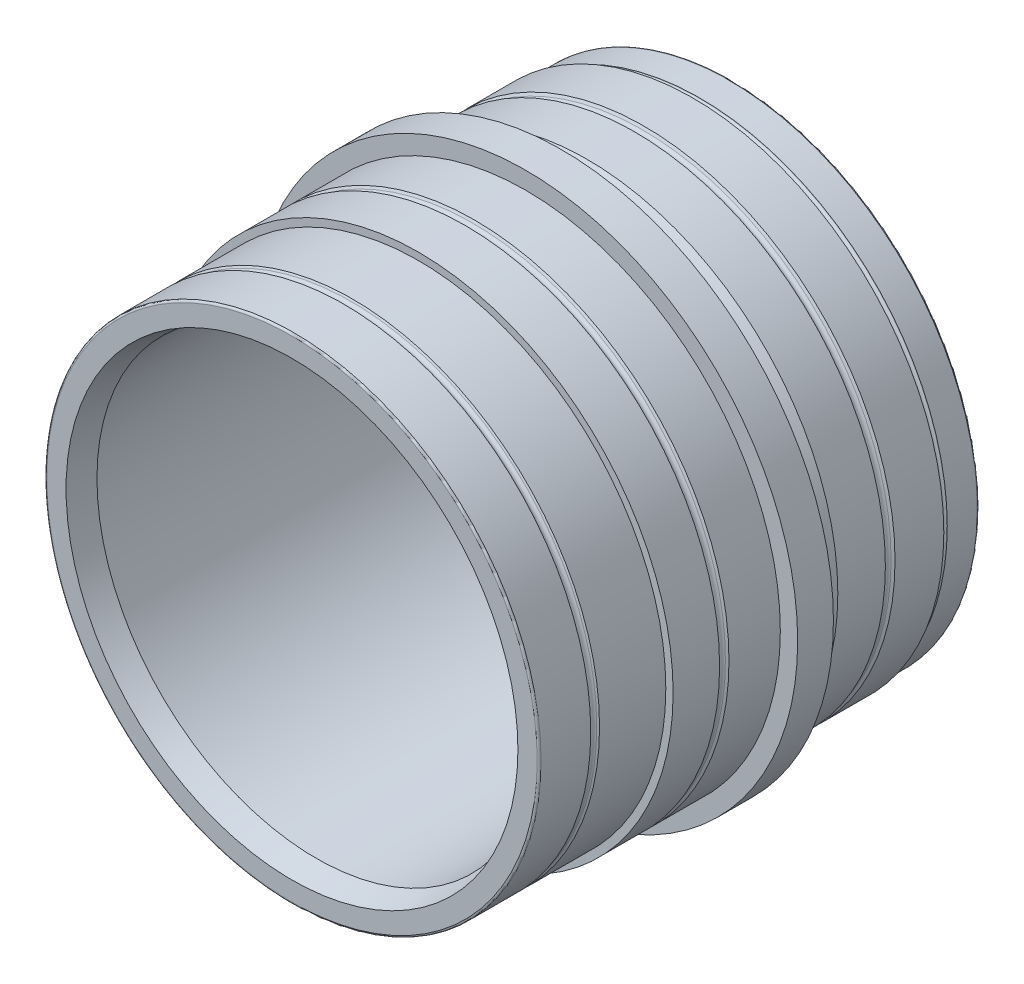
ISO-10303-21;
HEADER;
FILE_DESCRIPTION(('STEP AP214'),'2;1');
FILE_NAME('part.step','',(''),(''),'','','');
FILE_SCHEMA(('AUTOMOTIVE_DESIGN { 1 0 10303 214 1 1 1 1 }'));
ENDSEC;
DATA;
#1=APPLICATION_CONTEXT('core data for automotive mechanical design processes');
#2=APPLICATION_PROTOCOL_DEFINITION('international standard','automotive_design',2000,#1);
#3=PRODUCT_CONTEXT('',#1,'mechanical');
#4=PRODUCT('Part','Part','',(#3));
#5=PRODUCT_RELATED_PRODUCT_CATEGORY('part','',(#4));
#6=PRODUCT_DEFINITION_FORMATION('','',#4);
#7=PRODUCT_DEFINITION_CONTEXT('part definition',#1,'design');
#8=PRODUCT_DEFINITION('design','',#6,#7);
#9=PRODUCT_DEFINITION_SHAPE('','',#8);
#10=(LENGTH_UNIT() NAMED_UNIT(*) SI_UNIT(.MILLI.,.METRE.));
#11=(NAMED_UNIT(*) PLANE_ANGLE_UNIT() SI_UNIT($,.RADIAN.));
#12=(NAMED_UNIT(*) SI_UNIT($,.STERADIAN.) SOLID_ANGLE_UNIT());
#13=UNCERTAINTY_MEASURE_WITH_UNIT(LENGTH_MEASURE(1.E-05),#10,'distance_accuracy_value','');
#14=(GEOMETRIC_REPRESENTATION_CONTEXT(3) GLOBAL_UNCERTAINTY_ASSIGNED_CONTEXT((#13)) GLOBAL_UNIT_ASSIGNED_CONTEXT((#10,
#11,#12)) REPRESENTATION_CONTEXT('',''));
#15=CARTESIAN_POINT('',(0.,0.,0.));
#16=DIRECTION('',(0.,0.,1.));
#17=DIRECTION('',(1.,0.,0.));
#18=AXIS2_PLACEMENT_3D('',#15,#16,#17);
#19=CARTESIAN_POINT('',(0.,25.1575,0.));
#20=DIRECTION('',(0.,0.,-1.));
#21=DIRECTION('',(-1.,0.,0.));
#22=AXIS2_PLACEMENT_3D('',#19,#20,#21);
#23=PLANE('',#22);
#24=CARTESIAN_POINT('',(0.,0.,0.));
#25=DIRECTION('',(0.,0.,1.));
#26=DIRECTION('',(1.,0.,0.));
#27=AXIS2_PLACEMENT_3D('',#24,#25,#26);
#28=CIRCLE('',#27,23.1823729810778);
#29=CARTESIAN_POINT('',(23.1823729810778,0.,0.));
#30=VERTEX_POINT('',#29);
#31=EDGE_CURVE('E10',#30,#30,#28,.T.);
#32=ORIENTED_EDGE('',*,*,#31,.F.);
#33=EDGE_LOOP('',(#32));
#34=FACE_BOUND('',#33,.T.);
#35=CARTESIAN_POINT('',(0.,0.,0.));
#36=DIRECTION('',(0.,0.,1.));
#37=DIRECTION('',(1.,0.,0.));
#38=AXIS2_PLACEMENT_3D('',#35,#36,#37);
#39=CIRCLE('',#38,25.1575);
#40=CARTESIAN_POINT('',(25.1575,0.,0.));
#41=VERTEX_POINT('',#40);
#42=EDGE_CURVE('E148',#41,#41,#39,.T.);
#43=ORIENTED_EDGE('',*,*,#42,.T.);
#44=EDGE_LOOP('',(#43));
#45=FACE_BOUND('',#44,.T.);
#46=ADVANCED_FACE('F39',(#34,#45),#23,.F.);
#47=CARTESIAN_POINT('',(0.,0.,0.));
#48=DIRECTION('',(0.,0.,1.));
#49=DIRECTION('',(1.,0.,0.));
#50=AXIS2_PLACEMENT_3D('',#47,#48,#49);
#51=CONICAL_SURFACE('',#50,23.1823729810778,0.26179938779915);
#52=CARTESIAN_POINT('',(0.,0.,-2.5));
#53=DIRECTION('',(0.,0.,1.));
#54=DIRECTION('',(1.,0.,0.));
#55=AXIS2_PLACEMENT_3D('',#52,#53,#54);
#56=CIRCLE('',#55,22.5125);
#57=CARTESIAN_POINT('',(22.5125,0.,-2.5));
#58=VERTEX_POINT('',#57);
#59=EDGE_CURVE('E45',#58,#58,#56,.T.);
#60=ORIENTED_EDGE('',*,*,#59,.F.);
#61=EDGE_LOOP('',(#60));
#62=FACE_BOUND('',#61,.T.);
#63=ORIENTED_EDGE('',*,*,#31,.T.);
#64=EDGE_LOOP('',(#63));
#65=FACE_BOUND('',#64,.T.);
#66=ADVANCED_FACE('F347',(#62,#65),#51,.F.);
#67=CARTESIAN_POINT('',(0.,0.,0.));
#68=DIRECTION('',(0.,0.,1.));
#69=DIRECTION('',(1.,0.,0.));
#70=AXIS2_PLACEMENT_3D('',#67,#68,#69);
#71=CYLINDRICAL_SURFACE('',#70,22.5125);
#72=CARTESIAN_POINT('',(0.,0.,-42.65));
#73=DIRECTION('',(0.,0.,1.));
#74=DIRECTION('',(1.,0.,0.));
#75=AXIS2_PLACEMENT_3D('',#72,#73,#74);
#76=CIRCLE('',#75,22.5125);
#77=CARTESIAN_POINT('',(22.5125,0.,-42.65));
#78=VERTEX_POINT('',#77);
#79=EDGE_CURVE('E49',#78,#78,#76,.T.);
#80=ORIENTED_EDGE('',*,*,#79,.F.);
#81=EDGE_LOOP('',(#80));
#82=FACE_BOUND('',#81,.T.);
#83=ORIENTED_EDGE('',*,*,#59,.T.);
#84=EDGE_LOOP('',(#83));
#85=FACE_BOUND('',#84,.T.);
#86=ADVANCED_FACE('F342',(#82,#85),#71,.F.);
#87=CARTESIAN_POINT('',(0.,0.,-42.65));
#88=DIRECTION('',(0.,0.,-1.));
#89=DIRECTION('',(-1.,0.,0.));
#90=AXIS2_PLACEMENT_3D('',#87,#88,#89);
#91=CONICAL_SURFACE('',#90,22.5125,0.261799387799151);
#92=CARTESIAN_POINT('',(0.,0.,-45.15));
#93=DIRECTION('',(0.,0.,1.));
#94=DIRECTION('',(1.,0.,0.));
#95=AXIS2_PLACEMENT_3D('',#92,#93,#94);
#96=CIRCLE('',#95,23.1823729810778);
#97=CARTESIAN_POINT('',(23.1823729810778,0.,-45.15));
#98=VERTEX_POINT('',#97);
#99=EDGE_CURVE('E53',#98,#98,#96,.T.);
#100=ORIENTED_EDGE('',*,*,#99,.F.);
#101=EDGE_LOOP('',(#100));
#102=FACE_BOUND('',#101,.T.);
#103=ORIENTED_EDGE('',*,*,#79,.T.);
#104=EDGE_LOOP('',(#103));
#105=FACE_BOUND('',#104,.T.);
#106=ADVANCED_FACE('F336',(#102,#105),#91,.F.);
#107=CARTESIAN_POINT('',(0.,23.1823729810778,-45.15));
#108=DIRECTION('',(0.,0.,1.));
#109=DIRECTION('',(1.,0.,0.));
#110=AXIS2_PLACEMENT_3D('',#107,#108,#109);
#111=PLANE('',#110);
#112=CARTESIAN_POINT('',(0.,0.,-45.15));
#113=DIRECTION('',(0.,0.,1.));
#114=DIRECTION('',(1.,0.,0.));
#115=AXIS2_PLACEMENT_3D('',#112,#113,#114);
#116=CIRCLE('',#115,25.1575);
#117=CARTESIAN_POINT('',(25.1575,0.,-45.15));
#118=VERTEX_POINT('',#117);
#119=EDGE_CURVE('E58',#118,#118,#116,.T.);
#120=ORIENTED_EDGE('',*,*,#119,.F.);
#121=EDGE_LOOP('',(#120));
#122=FACE_BOUND('',#121,.T.);
#123=ORIENTED_EDGE('',*,*,#99,.T.);
#124=EDGE_LOOP('',(#123));
#125=FACE_BOUND('',#124,.T.);
#126=ADVANCED_FACE('F330',(#122,#125),#111,.F.);
#127=CARTESIAN_POINT('',(0.,0.,-44.95));
#128=DIRECTION('',(0.,0.,1.));
#129=DIRECTION('',(1.,0.,0.));
#130=AXIS2_PLACEMENT_3D('',#127,#128,#129);
#131=TOROIDAL_SURFACE('',#130,25.1575,0.199999999999999);
#132=CARTESIAN_POINT('',(0.,0.,-44.95));
#133=DIRECTION('',(0.,0.,1.));
#134=DIRECTION('',(1.,0.,0.));
#135=AXIS2_PLACEMENT_3D('',#132,#133,#134);
#136=CIRCLE('',#135,25.3575);
#137=CARTESIAN_POINT('',(25.3575,0.,-44.95));
#138=VERTEX_POINT('',#137);
#139=EDGE_CURVE('E61',#138,#138,#136,.T.);
#140=ORIENTED_EDGE('',*,*,#139,.F.);
#141=EDGE_LOOP('',(#140));
#142=FACE_BOUND('',#141,.T.);
#143=ORIENTED_EDGE('',*,*,#119,.T.);
#144=EDGE_LOOP('',(#143));
#145=FACE_BOUND('',#144,.T.);
#146=ADVANCED_FACE('F324',(#142,#145),#131,.T.);
#147=CARTESIAN_POINT('',(0.,0.,0.));
#148=DIRECTION('',(0.,0.,1.));
#149=DIRECTION('',(1.,0.,0.));
#150=AXIS2_PLACEMENT_3D('',#147,#148,#149);
#151=CYLINDRICAL_SURFACE('',#150,25.3575);
#152=CARTESIAN_POINT('',(0.,0.,-41.8803480905249));
#153=DIRECTION('',(0.,0.,1.));
#154=DIRECTION('',(1.,0.,0.));
#155=AXIS2_PLACEMENT_3D('',#152,#153,#154);
#156=CIRCLE('',#155,25.3575);
#157=CARTESIAN_POINT('',(25.3575,0.,-41.8803480905249));
#158=VERTEX_POINT('',#157);
#159=EDGE_CURVE('E64',#158,#158,#156,.T.);
#160=ORIENTED_EDGE('',*,*,#159,.F.);
#161=EDGE_LOOP('',(#160));
#162=FACE_BOUND('',#161,.T.);
#163=ORIENTED_EDGE('',*,*,#139,.T.);
#164=EDGE_LOOP('',(#163));
#165=FACE_BOUND('',#164,.T.);
#166=ADVANCED_FACE('F318',(#162,#165),#151,.T.);
#167=CARTESIAN_POINT('',(0.,0.,-41.8803480905249));
#168=DIRECTION('',(0.,0.,-1.));
#169=DIRECTION('',(-1.,0.,0.));
#170=AXIS2_PLACEMENT_3D('',#167,#168,#169);
#171=CONICAL_SURFACE('',#170,25.3575,1.04719755119731);
#172=CARTESIAN_POINT('',(0.,0.,-41.8615842067762));
#173=DIRECTION('',(0.,0.,1.));
#174=DIRECTION('',(1.,0.,0.));
#175=AXIS2_PLACEMENT_3D('',#172,#173,#174);
#176=CIRCLE('',#175,25.325);
#177=CARTESIAN_POINT('',(25.325,0.,-41.8615842067762));
#178=VERTEX_POINT('',#177);
#179=EDGE_CURVE('E67',#178,#178,#176,.T.);
#180=ORIENTED_EDGE('',*,*,#179,.F.);
#181=EDGE_LOOP('',(#180));
#182=FACE_BOUND('',#181,.T.);
#183=ORIENTED_EDGE('',*,*,#159,.T.);
#184=EDGE_LOOP('',(#183));
#185=FACE_BOUND('',#184,.T.);
#186=ADVANCED_FACE('F312',(#182,#185),#171,.T.);
#187=CARTESIAN_POINT('',(0.,0.,-41.5151740452624));
#188=DIRECTION('',(0.,0.,1.));
#189=DIRECTION('',(1.,0.,0.));
#190=AXIS2_PLACEMENT_3D('',#187,#188,#189);
#191=TOROIDAL_SURFACE('',#190,25.525,0.400000000000013);
#192=CARTESIAN_POINT('',(0.,0.,-41.1687638837486));
#193=DIRECTION('',(0.,0.,1.));
#194=DIRECTION('',(1.,0.,0.));
#195=AXIS2_PLACEMENT_3D('',#192,#193,#194);
#196=CIRCLE('',#195,25.325);
#197=CARTESIAN_POINT('',(25.325,0.,-41.1687638837486));
#198=VERTEX_POINT('',#197);
#199=EDGE_CURVE('E70',#198,#198,#196,.T.);
#200=ORIENTED_EDGE('',*,*,#199,.F.);
#201=EDGE_LOOP('',(#200));
#202=FACE_BOUND('',#201,.T.);
#203=ORIENTED_EDGE('',*,*,#179,.T.);
#204=EDGE_LOOP('',(#203));
#205=FACE_BOUND('',#204,.T.);
#206=ADVANCED_FACE('F306',(#202,#205),#191,.F.);
#207=CARTESIAN_POINT('',(0.,0.,-41.1687638837486));
#208=DIRECTION('',(0.,0.,1.));
#209=DIRECTION('',(1.,0.,0.));
#210=AXIS2_PLACEMENT_3D('',#207,#208,#209);
#211=CONICAL_SURFACE('',#210,25.325,1.04719755119701);
#212=CARTESIAN_POINT('',(0.,0.,-41.15));
#213=DIRECTION('',(0.,0.,1.));
#214=DIRECTION('',(1.,0.,0.));
#215=AXIS2_PLACEMENT_3D('',#212,#213,#214);
#216=CIRCLE('',#215,25.3575);
#217=CARTESIAN_POINT('',(25.3575,0.,-41.15));
#218=VERTEX_POINT('',#217);
#219=EDGE_CURVE('E73',#218,#218,#216,.T.);
#220=ORIENTED_EDGE('',*,*,#219,.F.);
#221=EDGE_LOOP('',(#220));
#222=FACE_BOUND('',#221,.T.);
#223=ORIENTED_EDGE('',*,*,#199,.T.);
#224=EDGE_LOOP('',(#223));
#225=FACE_BOUND('',#224,.T.);
#226=ADVANCED_FACE('F300',(#222,#225),#211,.T.);
#227=CARTESIAN_POINT('',(0.,25.3575,-41.15));
#228=DIRECTION('',(0.,0.,1.));
#229=DIRECTION('',(1.,0.,0.));
#230=AXIS2_PLACEMENT_3D('',#227,#228,#229);
#231=PLANE('',#230);
#232=CARTESIAN_POINT('',(0.,0.,-41.15));
#233=DIRECTION('',(0.,0.,1.));
#234=DIRECTION('',(1.,0.,0.));
#235=AXIS2_PLACEMENT_3D('',#232,#233,#234);
#236=CIRCLE('',#235,25.7325);
#237=CARTESIAN_POINT('',(25.7325,0.,-41.15));
#238=VERTEX_POINT('',#237);
#239=EDGE_CURVE('E76',#238,#238,#236,.T.);
#240=ORIENTED_EDGE('',*,*,#239,.F.);
#241=EDGE_LOOP('',(#240));
#242=FACE_BOUND('',#241,.T.);
#243=ORIENTED_EDGE('',*,*,#219,.T.);
#244=EDGE_LOOP('',(#243));
#245=FACE_BOUND('',#244,.T.);
#246=ADVANCED_FACE('F294',(#242,#245),#231,.F.);
#247=CARTESIAN_POINT('',(0.,0.,0.));
#248=DIRECTION('',(0.,0.,1.));
#249=DIRECTION('',(1.,0.,0.));
#250=AXIS2_PLACEMENT_3D('',#247,#248,#249);
#251=CYLINDRICAL_SURFACE('',#250,25.7325);
#252=CARTESIAN_POINT('',(0.,0.,-36.1450778558301));
#253=DIRECTION('',(0.,0.,1.));
#254=DIRECTION('',(1.,0.,0.));
#255=AXIS2_PLACEMENT_3D('',#252,#253,#254);
#256=CIRCLE('',#255,25.7325);
#257=CARTESIAN_POINT('',(25.7325,0.,-36.1450778558301));
#258=VERTEX_POINT('',#257);
#259=EDGE_CURVE('E79',#258,#258,#256,.T.);
#260=ORIENTED_EDGE('',*,*,#259,.F.);
#261=EDGE_LOOP('',(#260));
#262=FACE_BOUND('',#261,.T.);
#263=ORIENTED_EDGE('',*,*,#239,.T.);
#264=EDGE_LOOP('',(#263));
#265=FACE_BOUND('',#264,.T.);
#266=ADVANCED_FACE('F288',(#262,#265),#251,.T.);
#267=CARTESIAN_POINT('',(0.,0.,-36.1450778558301));
#268=DIRECTION('',(0.,0.,-1.));
#269=DIRECTION('',(-1.,0.,0.));
#270=AXIS2_PLACEMENT_3D('',#267,#268,#269);
#271=CONICAL_SURFACE('',#270,25.7325,1.04719755119668);
#272=CARTESIAN_POINT('',(0.,0.,-35.9964101615138));
#273=DIRECTION('',(0.,0.,1.));
#274=DIRECTION('',(1.,0.,0.));
#275=AXIS2_PLACEMENT_3D('',#272,#273,#274);
#276=CIRCLE('',#275,25.475);
#277=CARTESIAN_POINT('',(25.475,0.,-35.9964101615138));
#278=VERTEX_POINT('',#277);
#279=EDGE_CURVE('E82',#278,#278,#276,.T.);
#280=ORIENTED_EDGE('',*,*,#279,.F.);
#281=EDGE_LOOP('',(#280));
#282=FACE_BOUND('',#281,.T.);
#283=ORIENTED_EDGE('',*,*,#259,.T.);
#284=EDGE_LOOP('',(#283));
#285=FACE_BOUND('',#284,.T.);
#286=ADVANCED_FACE('F282',(#282,#285),#271,.T.);
#287=CARTESIAN_POINT('',(0.,0.,-35.65));
#288=DIRECTION('',(0.,0.,1.));
#289=DIRECTION('',(1.,0.,0.));
#290=AXIS2_PLACEMENT_3D('',#287,#288,#289);
#291=TOROIDAL_SURFACE('',#290,25.675,0.400000000000022);
#292=CARTESIAN_POINT('',(0.,0.,-35.3035898384862));
#293=DIRECTION('',(0.,0.,1.));
#294=DIRECTION('',(1.,0.,0.));
#295=AXIS2_PLACEMENT_3D('',#292,#293,#294);
#296=CIRCLE('',#295,25.475);
#297=CARTESIAN_POINT('',(25.475,0.,-35.3035898384862));
#298=VERTEX_POINT('',#297);
#299=EDGE_CURVE('E85',#298,#298,#296,.T.);
#300=ORIENTED_EDGE('',*,*,#299,.F.);
#301=EDGE_LOOP('',(#300));
#302=FACE_BOUND('',#301,.T.);
#303=ORIENTED_EDGE('',*,*,#279,.T.);
#304=EDGE_LOOP('',(#303));
#305=FACE_BOUND('',#304,.T.);
#306=ADVANCED_FACE('F276',(#302,#305),#291,.F.);
#307=CARTESIAN_POINT('',(0.,0.,-35.3035898384862));
#308=DIRECTION('',(0.,0.,1.));
#309=DIRECTION('',(1.,0.,0.));
#310=AXIS2_PLACEMENT_3D('',#307,#308,#309);
#311=CONICAL_SURFACE('',#310,25.475,1.04719755119669);
#312=CARTESIAN_POINT('',(0.,0.,-35.1549221441699));
#313=DIRECTION('',(0.,0.,1.));
#314=DIRECTION('',(1.,0.,0.));
#315=AXIS2_PLACEMENT_3D('',#312,#313,#314);
#316=CIRCLE('',#315,25.7325);
#317=CARTESIAN_POINT('',(25.7325,0.,-35.1549221441699));
#318=VERTEX_POINT('',#317);
#319=EDGE_CURVE('E88',#318,#318,#316,.T.);
#320=ORIENTED_EDGE('',*,*,#319,.F.);
#321=EDGE_LOOP('',(#320));
#322=FACE_BOUND('',#321,.T.);
#323=ORIENTED_EDGE('',*,*,#299,.T.);
#324=EDGE_LOOP('',(#323));
#325=FACE_BOUND('',#324,.T.);
#326=ADVANCED_FACE('F270',(#322,#325),#311,.T.);
#327=CARTESIAN_POINT('',(0.,0.,0.));
#328=DIRECTION('',(0.,0.,1.));
#329=DIRECTION('',(1.,0.,0.));
#330=AXIS2_PLACEMENT_3D('',#327,#328,#329);
#331=CYLINDRICAL_SURFACE('',#330,25.7325);
#332=CARTESIAN_POINT('',(0.,0.,-30.275));
#333=DIRECTION('',(0.,0.,1.));
#334=DIRECTION('',(1.,0.,0.));
#335=AXIS2_PLACEMENT_3D('',#332,#333,#334);
#336=CIRCLE('',#335,25.7325);
#337=CARTESIAN_POINT('',(25.7325,0.,-30.275));
#338=VERTEX_POINT('',#337);
#339=EDGE_CURVE('E91',#338,#338,#336,.T.);
#340=ORIENTED_EDGE('',*,*,#339,.F.);
#341=EDGE_LOOP('',(#340));
#342=FACE_BOUND('',#341,.T.);
#343=ORIENTED_EDGE('',*,*,#319,.T.);
#344=EDGE_LOOP('',(#343));
#345=FACE_BOUND('',#344,.T.);
#346=ADVANCED_FACE('F264',(#342,#345),#331,.T.);
#347=CARTESIAN_POINT('',(0.,0.,-30.275));
#348=DIRECTION('',(0.,0.,-1.));
#349=DIRECTION('',(-1.,0.,0.));
#350=AXIS2_PLACEMENT_3D('',#347,#348,#349);
#351=CONICAL_SURFACE('',#350,25.7325,0.26179938779915);
#352=CARTESIAN_POINT('',(0.,0.,-29.313996917051));
#353=DIRECTION('',(0.,0.,1.));
#354=DIRECTION('',(1.,0.,0.));
#355=AXIS2_PLACEMENT_3D('',#352,#353,#354);
#356=CIRCLE('',#355,25.475);
#357=CARTESIAN_POINT('',(25.475,0.,-29.313996917051));
#358=VERTEX_POINT('',#357);
#359=EDGE_CURVE('E94',#358,#358,#356,.T.);
#360=ORIENTED_EDGE('',*,*,#359,.F.);
#361=EDGE_LOOP('',(#360));
#362=FACE_BOUND('',#361,.T.);
#363=ORIENTED_EDGE('',*,*,#339,.T.);
#364=EDGE_LOOP('',(#363));
#365=FACE_BOUND('',#364,.T.);
#366=ADVANCED_FACE('F258',(#362,#365),#351,.T.);
#367=CARTESIAN_POINT('',(0.,0.,0.));
#368=DIRECTION('',(0.,0.,1.));
#369=DIRECTION('',(1.,0.,0.));
#370=AXIS2_PLACEMENT_3D('',#367,#368,#369);
#371=CYLINDRICAL_SURFACE('',#370,25.475);
#372=CARTESIAN_POINT('',(0.,0.,-28.775));
#373=DIRECTION('',(0.,0.,1.));
#374=DIRECTION('',(1.,0.,0.));
#375=AXIS2_PLACEMENT_3D('',#372,#373,#374);
#376=CIRCLE('',#375,25.475);
#377=CARTESIAN_POINT('',(25.475,0.,-28.775));
#378=VERTEX_POINT('',#377);
#379=EDGE_CURVE('E97',#378,#378,#376,.T.);
#380=ORIENTED_EDGE('',*,*,#379,.F.);
#381=EDGE_LOOP('',(#380));
#382=FACE_BOUND('',#381,.T.);
#383=ORIENTED_EDGE('',*,*,#359,.T.);
#384=EDGE_LOOP('',(#383));
#385=FACE_BOUND('',#384,.T.);
#386=ADVANCED_FACE('F252',(#382,#385),#371,.T.);
#387=CARTESIAN_POINT('',(0.,0.,-28.775));
#388=DIRECTION('',(0.,0.,1.));
#389=DIRECTION('',(1.,0.,0.));
#390=AXIS2_PLACEMENT_3D('',#387,#388,#389);
#391=TOROIDAL_SURFACE('',#390,25.975,0.5);
#392=CARTESIAN_POINT('',(0.,0.,-28.275));
#393=DIRECTION('',(0.,0.,1.));
#394=DIRECTION('',(1.,0.,0.));
#395=AXIS2_PLACEMENT_3D('',#392,#393,#394);
#396=CIRCLE('',#395,25.975);
#397=CARTESIAN_POINT('',(25.975,0.,-28.275));
#398=VERTEX_POINT('',#397);
#399=EDGE_CURVE('E100',#398,#398,#396,.T.);
#400=ORIENTED_EDGE('',*,*,#399,.F.);
#401=EDGE_LOOP('',(#400));
#402=FACE_BOUND('',#401,.T.);
#403=ORIENTED_EDGE('',*,*,#379,.T.);
#404=EDGE_LOOP('',(#403));
#405=FACE_BOUND('',#404,.T.);
#406=ADVANCED_FACE('F246',(#402,#405),#391,.F.);
#407=CARTESIAN_POINT('',(0.,25.975,-28.275));
#408=DIRECTION('',(0.,0.,1.));
#409=DIRECTION('',(1.,0.,0.));
#410=AXIS2_PLACEMENT_3D('',#407,#408,#409);
#411=PLANE('',#410);
#412=CARTESIAN_POINT('',(0.,0.,-28.275));
#413=DIRECTION('',(0.,0.,1.));
#414=DIRECTION('',(1.,0.,0.));
#415=AXIS2_PLACEMENT_3D('',#412,#413,#414);
#416=CIRCLE('',#415,26.8375);
#417=CARTESIAN_POINT('',(26.8375,0.,-28.275));
#418=VERTEX_POINT('',#417);
#419=EDGE_CURVE('E103',#418,#418,#416,.T.);
#420=ORIENTED_EDGE('',*,*,#419,.F.);
#421=EDGE_LOOP('',(#420));
#422=FACE_BOUND('',#421,.T.);
#423=ORIENTED_EDGE('',*,*,#399,.T.);
#424=EDGE_LOOP('',(#423));
#425=FACE_BOUND('',#424,.T.);
#426=ADVANCED_FACE('F240',(#422,#425),#411,.F.);
#427=CARTESIAN_POINT('',(0.,0.,-28.275));
#428=DIRECTION('',(0.,0.,1.));
#429=DIRECTION('',(1.,0.,0.));
#430=AXIS2_PLACEMENT_3D('',#427,#428,#429);
#431=CONICAL_SURFACE('',#430,26.8375,1.0471975511966);
#432=CARTESIAN_POINT('',(0.,0.,-27.6687822173509));
#433=DIRECTION('',(0.,0.,1.));
#434=DIRECTION('',(1.,0.,0.));
#435=AXIS2_PLACEMENT_3D('',#432,#433,#434);
#436=CIRCLE('',#435,27.8875);
#437=CARTESIAN_POINT('',(27.8875,0.,-27.6687822173509));
#438=VERTEX_POINT('',#437);
#439=EDGE_CURVE('E106',#438,#438,#436,.T.);
#440=ORIENTED_EDGE('',*,*,#439,.F.);
#441=EDGE_LOOP('',(#440));
#442=FACE_BOUND('',#441,.T.);
#443=ORIENTED_EDGE('',*,*,#419,.T.);
#444=EDGE_LOOP('',(#443));
#445=FACE_BOUND('',#444,.T.);
#446=ADVANCED_FACE('F234',(#442,#445),#431,.T.);
#447=CARTESIAN_POINT('',(0.,0.,0.));
#448=DIRECTION('',(0.,0.,1.));
#449=DIRECTION('',(1.,0.,0.));
#450=AXIS2_PLACEMENT_3D('',#447,#448,#449);
#451=CYLINDRICAL_SURFACE('',#450,27.8875);
#452=CARTESIAN_POINT('',(0.,0.,-24.));
#453=DIRECTION('',(0.,0.,1.));
#454=DIRECTION('',(1.,0.,0.));
#455=AXIS2_PLACEMENT_3D('',#452,#453,#454);
#456=CIRCLE('',#455,27.8875);
#457=CARTESIAN_POINT('',(27.8875,0.,-24.));
#458=VERTEX_POINT('',#457);
#459=EDGE_CURVE('E109',#458,#458,#456,.T.);
#460=ORIENTED_EDGE('',*,*,#459,.F.);
#461=EDGE_LOOP('',(#460));
#462=FACE_BOUND('',#461,.T.);
#463=ORIENTED_EDGE('',*,*,#439,.T.);
#464=EDGE_LOOP('',(#463));
#465=FACE_BOUND('',#464,.T.);
#466=ADVANCED_FACE('F228',(#462,#465),#451,.T.);
#467=CARTESIAN_POINT('',(0.,27.8875,-24.));
#468=DIRECTION('',(0.,0.,-1.));
#469=DIRECTION('',(-1.,0.,0.));
#470=AXIS2_PLACEMENT_3D('',#467,#468,#469);
#471=PLANE('',#470);
#472=CARTESIAN_POINT('',(0.,0.,-24.));
#473=DIRECTION('',(0.,0.,1.));
#474=DIRECTION('',(1.,0.,0.));
#475=AXIS2_PLACEMENT_3D('',#472,#473,#474);
#476=CIRCLE('',#475,26.1075);
#477=CARTESIAN_POINT('',(26.1075,0.,-24.));
#478=VERTEX_POINT('',#477);
#479=EDGE_CURVE('E112',#478,#478,#476,.T.);
#480=ORIENTED_EDGE('',*,*,#479,.F.);
#481=EDGE_LOOP('',(#480));
#482=FACE_BOUND('',#481,.T.);
#483=ORIENTED_EDGE('',*,*,#459,.T.);
#484=EDGE_LOOP('',(#483));
#485=FACE_BOUND('',#484,.T.);
#486=ADVANCED_FACE('F222',(#482,#485),#471,.F.);
#487=CARTESIAN_POINT('',(0.,0.,0.));
#488=DIRECTION('',(0.,0.,1.));
#489=DIRECTION('',(1.,0.,0.));
#490=AXIS2_PLACEMENT_3D('',#487,#488,#489);
#491=CYLINDRICAL_SURFACE('',#490,26.1075);
#492=CARTESIAN_POINT('',(0.,0.,-18.7306440991004));
#493=DIRECTION('',(0.,0.,1.));
#494=DIRECTION('',(1.,0.,0.));
#495=AXIS2_PLACEMENT_3D('',#492,#493,#494);
#496=CIRCLE('',#495,26.1075);
#497=CARTESIAN_POINT('',(26.1075,0.,-18.7306440991004));
#498=VERTEX_POINT('',#497);
#499=EDGE_CURVE('E115',#498,#498,#496,.T.);
#500=ORIENTED_EDGE('',*,*,#499,.F.);
#501=EDGE_LOOP('',(#500));
#502=FACE_BOUND('',#501,.T.);
#503=ORIENTED_EDGE('',*,*,#479,.T.);
#504=EDGE_LOOP('',(#503));
#505=FACE_BOUND('',#504,.T.);
#506=ADVANCED_FACE('F216',(#502,#505),#491,.T.);
#507=CARTESIAN_POINT('',(0.,0.,-18.7306440991004));
#508=DIRECTION('',(0.,0.,-1.));
#509=DIRECTION('',(-1.,0.,0.));
#510=AXIS2_PLACEMENT_3D('',#507,#508,#509);
#511=CONICAL_SURFACE('',#510,26.1075,1.04719755119661);
#512=CARTESIAN_POINT('',(0.,0.,-18.5964101615138));
#513=DIRECTION('',(0.,0.,1.));
#514=DIRECTION('',(1.,0.,0.));
#515=AXIS2_PLACEMENT_3D('',#512,#513,#514);
#516=CIRCLE('',#515,25.875);
#517=CARTESIAN_POINT('',(25.875,0.,-18.5964101615138));
#518=VERTEX_POINT('',#517);
#519=EDGE_CURVE('E118',#518,#518,#516,.T.);
#520=ORIENTED_EDGE('',*,*,#519,.F.);
#521=EDGE_LOOP('',(#520));
#522=FACE_BOUND('',#521,.T.);
#523=ORIENTED_EDGE('',*,*,#499,.T.);
#524=EDGE_LOOP('',(#523));
#525=FACE_BOUND('',#524,.T.);
#526=ADVANCED_FACE('F210',(#522,#525),#511,.T.);
#527=CARTESIAN_POINT('',(0.,0.,-18.25));
#528=DIRECTION('',(0.,0.,1.));
#529=DIRECTION('',(1.,0.,0.));
#530=AXIS2_PLACEMENT_3D('',#527,#528,#529);
#531=TOROIDAL_SURFACE('',#530,26.075,0.4);
#532=CARTESIAN_POINT('',(0.,0.,-17.9035898384862));
#533=DIRECTION('',(0.,0.,1.));
#534=DIRECTION('',(1.,0.,0.));
#535=AXIS2_PLACEMENT_3D('',#532,#533,#534);
#536=CIRCLE('',#535,25.875);
#537=CARTESIAN_POINT('',(25.875,0.,-17.9035898384862));
#538=VERTEX_POINT('',#537);
#539=EDGE_CURVE('E121',#538,#538,#536,.T.);
#540=ORIENTED_EDGE('',*,*,#539,.F.);
#541=EDGE_LOOP('',(#540));
#542=FACE_BOUND('',#541,.T.);
#543=ORIENTED_EDGE('',*,*,#519,.T.);
#544=EDGE_LOOP('',(#543));
#545=FACE_BOUND('',#544,.T.);
#546=ADVANCED_FACE('F204',(#542,#545),#531,.F.);
#547=CARTESIAN_POINT('',(0.,0.,-17.9035898384862));
#548=DIRECTION('',(0.,0.,1.));
#549=DIRECTION('',(1.,0.,0.));
#550=AXIS2_PLACEMENT_3D('',#547,#548,#549);
#551=CONICAL_SURFACE('',#550,25.875,1.04719755119661);
#552=CARTESIAN_POINT('',(0.,0.,-17.7693559008996));
#553=DIRECTION('',(0.,0.,1.));
#554=DIRECTION('',(1.,0.,0.));
#555=AXIS2_PLACEMENT_3D('',#552,#553,#554);
#556=CIRCLE('',#555,26.1075);
#557=CARTESIAN_POINT('',(26.1075,0.,-17.7693559008996));
#558=VERTEX_POINT('',#557);
#559=EDGE_CURVE('E124',#558,#558,#556,.T.);
#560=ORIENTED_EDGE('',*,*,#559,.F.);
#561=EDGE_LOOP('',(#560));
#562=FACE_BOUND('',#561,.T.);
#563=ORIENTED_EDGE('',*,*,#539,.T.);
#564=EDGE_LOOP('',(#563));
#565=FACE_BOUND('',#564,.T.);
#566=ADVANCED_FACE('F198',(#562,#565),#551,.T.);
#567=CARTESIAN_POINT('',(0.,0.,0.));
#568=DIRECTION('',(0.,0.,1.));
#569=DIRECTION('',(1.,0.,0.));
#570=AXIS2_PLACEMENT_3D('',#567,#568,#569);
#571=CYLINDRICAL_SURFACE('',#570,26.1075);
#572=CARTESIAN_POINT('',(0.,0.,-13.));
#573=DIRECTION('',(0.,0.,1.));
#574=DIRECTION('',(1.,0.,0.));
#575=AXIS2_PLACEMENT_3D('',#572,#573,#574);
#576=CIRCLE('',#575,26.1075);
#577=CARTESIAN_POINT('',(26.1075,0.,-13.));
#578=VERTEX_POINT('',#577);
#579=EDGE_CURVE('E127',#578,#578,#576,.T.);
#580=ORIENTED_EDGE('',*,*,#579,.F.);
#581=EDGE_LOOP('',(#580));
#582=FACE_BOUND('',#581,.T.);
#583=ORIENTED_EDGE('',*,*,#559,.T.);
#584=EDGE_LOOP('',(#583));
#585=FACE_BOUND('',#584,.T.);
#586=ADVANCED_FACE('F192',(#582,#585),#571,.T.);
#587=CARTESIAN_POINT('',(0.,26.1075,-13.));
#588=DIRECTION('',(0.,0.,-1.));
#589=DIRECTION('',(-1.,0.,0.));
#590=AXIS2_PLACEMENT_3D('',#587,#588,#589);
#591=PLANE('',#590);
#592=CARTESIAN_POINT('',(0.,0.,-13.));
#593=DIRECTION('',(0.,0.,1.));
#594=DIRECTION('',(1.,0.,0.));
#595=AXIS2_PLACEMENT_3D('',#592,#593,#594);
#596=CIRCLE('',#595,25.3575);
#597=CARTESIAN_POINT('',(25.3575,0.,-13.));
#598=VERTEX_POINT('',#597);
#599=EDGE_CURVE('E130',#598,#598,#596,.T.);
#600=ORIENTED_EDGE('',*,*,#599,.F.);
#601=EDGE_LOOP('',(#600));
#602=FACE_BOUND('',#601,.T.);
#603=ORIENTED_EDGE('',*,*,#579,.T.);
#604=EDGE_LOOP('',(#603));
#605=FACE_BOUND('',#604,.T.);
#606=ADVANCED_FACE('F186',(#602,#605),#591,.F.);
#607=CARTESIAN_POINT('',(0.,0.,0.));
#608=DIRECTION('',(0.,0.,1.));
#609=DIRECTION('',(1.,0.,0.));
#610=AXIS2_PLACEMENT_3D('',#607,#608,#609);
#611=CYLINDRICAL_SURFACE('',#610,25.3575);
#612=CARTESIAN_POINT('',(0.,0.,-6.20177658564088));
#613=DIRECTION('',(0.,0.,1.));
#614=DIRECTION('',(1.,0.,0.));
#615=AXIS2_PLACEMENT_3D('',#612,#613,#614);
#616=CIRCLE('',#615,25.3575);
#617=CARTESIAN_POINT('',(25.3575,0.,-6.20177658564088));
#618=VERTEX_POINT('',#617);
#619=EDGE_CURVE('E133',#618,#618,#616,.T.);
#620=ORIENTED_EDGE('',*,*,#619,.F.);
#621=EDGE_LOOP('',(#620));
#622=FACE_BOUND('',#621,.T.);
#623=ORIENTED_EDGE('',*,*,#599,.T.);
#624=EDGE_LOOP('',(#623));
#625=FACE_BOUND('',#624,.T.);
#626=ADVANCED_FACE('F180',(#622,#625),#611,.T.);
#627=CARTESIAN_POINT('',(0.,0.,-6.20177658564088));
#628=DIRECTION('',(0.,0.,-1.));
#629=DIRECTION('',(-1.,0.,0.));
#630=AXIS2_PLACEMENT_3D('',#627,#628,#629);
#631=CONICAL_SURFACE('',#630,25.3575,1.04719755119661);
#632=CARTESIAN_POINT('',(0.,0.,-6.09641016151378));
#633=DIRECTION('',(0.,0.,1.));
#634=DIRECTION('',(1.,0.,0.));
#635=AXIS2_PLACEMENT_3D('',#632,#633,#634);
#636=CIRCLE('',#635,25.175);
#637=CARTESIAN_POINT('',(25.175,0.,-6.09641016151378));
#638=VERTEX_POINT('',#637);
#639=EDGE_CURVE('E136',#638,#638,#636,.T.);
#640=ORIENTED_EDGE('',*,*,#639,.F.);
#641=EDGE_LOOP('',(#640));
#642=FACE_BOUND('',#641,.T.);
#643=ORIENTED_EDGE('',*,*,#619,.T.);
#644=EDGE_LOOP('',(#643));
#645=FACE_BOUND('',#644,.T.);
#646=ADVANCED_FACE('F174',(#642,#645),#631,.T.);
#647=CARTESIAN_POINT('',(0.,0.,-5.75));
#648=DIRECTION('',(0.,0.,1.));
#649=DIRECTION('',(1.,0.,0.));
#650=AXIS2_PLACEMENT_3D('',#647,#648,#649);
#651=TOROIDAL_SURFACE('',#650,25.375,0.4);
#652=CARTESIAN_POINT('',(0.,0.,-5.40358983848622));
#653=DIRECTION('',(0.,0.,1.));
#654=DIRECTION('',(1.,0.,0.));
#655=AXIS2_PLACEMENT_3D('',#652,#653,#654);
#656=CIRCLE('',#655,25.175);
#657=CARTESIAN_POINT('',(25.175,0.,-5.40358983848622));
#658=VERTEX_POINT('',#657);
#659=EDGE_CURVE('E139',#658,#658,#656,.T.);
#660=ORIENTED_EDGE('',*,*,#659,.F.);
#661=EDGE_LOOP('',(#660));
#662=FACE_BOUND('',#661,.T.);
#663=ORIENTED_EDGE('',*,*,#639,.T.);
#664=EDGE_LOOP('',(#663));
#665=FACE_BOUND('',#664,.T.);
#666=ADVANCED_FACE('F168',(#662,#665),#651,.F.);
#667=CARTESIAN_POINT('',(0.,0.,-5.40358983848622));
#668=DIRECTION('',(0.,0.,1.));
#669=DIRECTION('',(1.,0.,0.));
#670=AXIS2_PLACEMENT_3D('',#667,#668,#669);
#671=CONICAL_SURFACE('',#670,25.175,1.04719755119661);
#672=CARTESIAN_POINT('',(0.,0.,-5.29822341435912));
#673=DIRECTION('',(0.,0.,1.));
#674=DIRECTION('',(1.,0.,0.));
#675=AXIS2_PLACEMENT_3D('',#672,#673,#674);
#676=CIRCLE('',#675,25.3575);
#677=CARTESIAN_POINT('',(25.3575,0.,-5.29822341435912));
#678=VERTEX_POINT('',#677);
#679=EDGE_CURVE('E142',#678,#678,#676,.T.);
#680=ORIENTED_EDGE('',*,*,#679,.F.);
#681=EDGE_LOOP('',(#680));
#682=FACE_BOUND('',#681,.T.);
#683=ORIENTED_EDGE('',*,*,#659,.T.);
#684=EDGE_LOOP('',(#683));
#685=FACE_BOUND('',#684,.T.);
#686=ADVANCED_FACE('F162',(#682,#685),#671,.T.);
#687=CARTESIAN_POINT('',(0.,0.,0.));
#688=DIRECTION('',(0.,0.,1.));
#689=DIRECTION('',(1.,0.,0.));
#690=AXIS2_PLACEMENT_3D('',#687,#688,#689);
#691=CYLINDRICAL_SURFACE('',#690,25.3575);
#692=CARTESIAN_POINT('',(0.,0.,-0.200000000000001));
#693=DIRECTION('',(0.,0.,1.));
#694=DIRECTION('',(1.,0.,0.));
#695=AXIS2_PLACEMENT_3D('',#692,#693,#694);
#696=CIRCLE('',#695,25.3575);
#697=CARTESIAN_POINT('',(25.3575,0.,-0.200000000000001));
#698=VERTEX_POINT('',#697);
#699=EDGE_CURVE('E145',#698,#698,#696,.T.);
#700=ORIENTED_EDGE('',*,*,#699,.F.);
#701=EDGE_LOOP('',(#700));
#702=FACE_BOUND('',#701,.T.);
#703=ORIENTED_EDGE('',*,*,#679,.T.);
#704=EDGE_LOOP('',(#703));
#705=FACE_BOUND('',#704,.T.);
#706=ADVANCED_FACE('F156',(#702,#705),#691,.T.);
#707=CARTESIAN_POINT('',(0.,0.,-0.2));
#708=DIRECTION('',(0.,0.,1.));
#709=DIRECTION('',(1.,0.,0.));
#710=AXIS2_PLACEMENT_3D('',#707,#708,#709);
#711=TOROIDAL_SURFACE('',#710,25.1575,0.199999999999999);
#712=ORIENTED_EDGE('',*,*,#42,.F.);
#713=EDGE_LOOP('',(#712));
#714=FACE_BOUND('',#713,.T.);
#715=ORIENTED_EDGE('',*,*,#699,.T.);
#716=EDGE_LOOP('',(#715));
#717=FACE_BOUND('',#716,.T.);
#718=ADVANCED_FACE('F153',(#714,#717),#711,.T.);
#719=CLOSED_SHELL('',(#46,#66,#86,#106,#126,#146,#166,#186,#206,#226,#246,#266,#286,#306,#326,
#346,#366,#386,#406,#426,#446,#466,#486,#506,#526,#546,#566,#586,#606,#626,#646,#666,#686,#706,#718));
#720=MANIFOLD_SOLID_BREP('B2',#719);
#721=ADVANCED_BREP_SHAPE_REPRESENTATION('',(#18,#720),#14);
#722=SHAPE_DEFINITION_REPRESENTATION(#9,#721);
ENDSEC;
END-ISO-10303-21;
